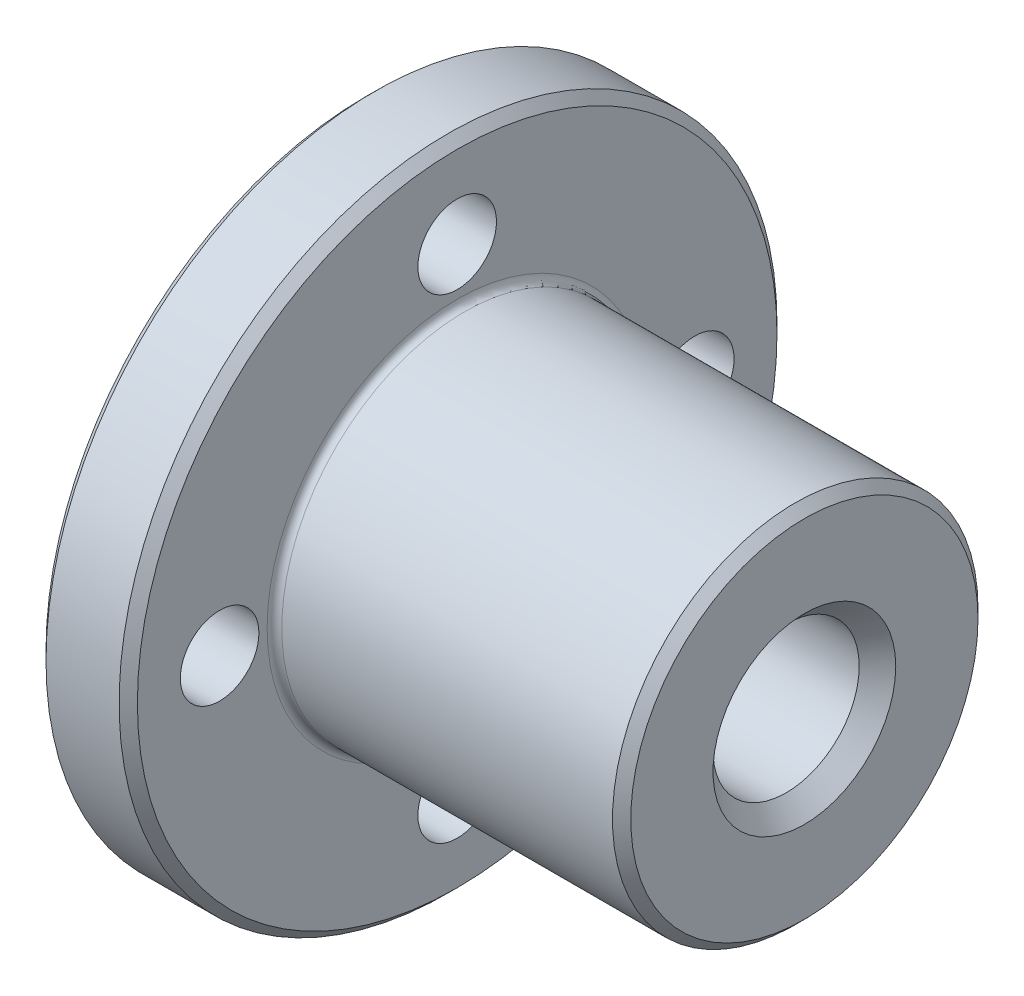
ISO-10303-21;
HEADER;
FILE_DESCRIPTION(('STEP AP214'),'2;1');
FILE_NAME('part.step','',(''),(''),'','','');
FILE_SCHEMA(('AUTOMOTIVE_DESIGN { 1 0 10303 214 1 1 1 1 }'));
ENDSEC;
DATA;
#1=APPLICATION_CONTEXT('core data for automotive mechanical design processes');
#2=APPLICATION_PROTOCOL_DEFINITION('international standard','automotive_design',2000,#1);
#3=PRODUCT_CONTEXT('',#1,'mechanical');
#4=PRODUCT('Part','Part','',(#3));
#5=PRODUCT_RELATED_PRODUCT_CATEGORY('part','',(#4));
#6=PRODUCT_DEFINITION_FORMATION('','',#4);
#7=PRODUCT_DEFINITION_CONTEXT('part definition',#1,'design');
#8=PRODUCT_DEFINITION('design','',#6,#7);
#9=PRODUCT_DEFINITION_SHAPE('','',#8);
#10=(LENGTH_UNIT() NAMED_UNIT(*) SI_UNIT(.MILLI.,.METRE.));
#11=(NAMED_UNIT(*) PLANE_ANGLE_UNIT() SI_UNIT($,.RADIAN.));
#12=(NAMED_UNIT(*) SI_UNIT($,.STERADIAN.) SOLID_ANGLE_UNIT());
#13=UNCERTAINTY_MEASURE_WITH_UNIT(LENGTH_MEASURE(1.E-05),#10,'distance_accuracy_value','');
#14=(GEOMETRIC_REPRESENTATION_CONTEXT(3) GLOBAL_UNCERTAINTY_ASSIGNED_CONTEXT((#13)) GLOBAL_UNIT_ASSIGNED_CONTEXT((#10,
#11,#12)) REPRESENTATION_CONTEXT('',''));
#15=CARTESIAN_POINT('',(0.,0.,0.));
#16=DIRECTION('',(0.,0.,1.));
#17=DIRECTION('',(1.,0.,0.));
#18=AXIS2_PLACEMENT_3D('',#15,#16,#17);
#19=CARTESIAN_POINT('',(5.,0.,0.));
#20=DIRECTION('',(1.,0.,0.));
#21=DIRECTION('',(0.,0.,-1.));
#22=AXIS2_PLACEMENT_3D('',#19,#20,#21);
#23=PLANE('',#22);
#24=CARTESIAN_POINT('',(5.,0.,0.));
#25=DIRECTION('',(1.,0.,0.));
#26=DIRECTION('',(0.,0.,-1.));
#27=AXIS2_PLACEMENT_3D('',#24,#25,#26);
#28=CIRCLE('',#27,10.4);
#29=CARTESIAN_POINT('',(5.,0.,-10.4));
#30=VERTEX_POINT('',#29);
#31=EDGE_CURVE('E10',#30,#30,#28,.F.);
#32=ORIENTED_EDGE('',*,*,#31,.T.);
#33=EDGE_LOOP('',(#32));
#34=FACE_BOUND('',#33,.T.);
#35=CARTESIAN_POINT('',(5.,0.,0.));
#36=DIRECTION('',(1.,0.,0.));
#37=DIRECTION('',(0.,0.,-1.));
#38=AXIS2_PLACEMENT_3D('',#35,#36,#37);
#39=CIRCLE('',#38,17.5);
#40=CARTESIAN_POINT('',(5.,0.,-17.5));
#41=VERTEX_POINT('',#40);
#42=EDGE_CURVE('E74',#41,#41,#39,.T.);
#43=ORIENTED_EDGE('',*,*,#42,.T.);
#44=EDGE_LOOP('',(#43));
#45=FACE_BOUND('',#44,.T.);
#46=CARTESIAN_POINT('',(5.,13.,0.));
#47=DIRECTION('',(1.,0.,0.));
#48=DIRECTION('',(0.,0.,-1.));
#49=AXIS2_PLACEMENT_3D('',#46,#47,#48);
#50=CIRCLE('',#49,2.14999999999999);
#51=CARTESIAN_POINT('',(5.,13.,-2.14999999999999));
#52=VERTEX_POINT('',#51);
#53=EDGE_CURVE('E95',#52,#52,#50,.T.);
#54=ORIENTED_EDGE('',*,*,#53,.F.);
#55=EDGE_LOOP('',(#54));
#56=FACE_BOUND('',#55,.T.);
#57=CARTESIAN_POINT('',(5.,-13.,0.));
#58=DIRECTION('',(1.,0.,0.));
#59=DIRECTION('',(0.,0.,-1.));
#60=AXIS2_PLACEMENT_3D('',#57,#58,#59);
#61=CIRCLE('',#60,2.14999999999999);
#62=CARTESIAN_POINT('',(5.,-13.,-2.14999999999999));
#63=VERTEX_POINT('',#62);
#64=EDGE_CURVE('E89',#63,#63,#61,.T.);
#65=ORIENTED_EDGE('',*,*,#64,.F.);
#66=EDGE_LOOP('',(#65));
#67=FACE_BOUND('',#66,.T.);
#68=CARTESIAN_POINT('',(5.,0.,-13.));
#69=DIRECTION('',(1.,0.,0.));
#70=DIRECTION('',(0.,0.,-1.));
#71=AXIS2_PLACEMENT_3D('',#68,#69,#70);
#72=CIRCLE('',#71,2.14999999999999);
#73=CARTESIAN_POINT('',(5.,0.,-15.15));
#74=VERTEX_POINT('',#73);
#75=EDGE_CURVE('E83',#74,#74,#72,.T.);
#76=ORIENTED_EDGE('',*,*,#75,.F.);
#77=EDGE_LOOP('',(#76));
#78=FACE_BOUND('',#77,.T.);
#79=CARTESIAN_POINT('',(5.,0.,13.));
#80=DIRECTION('',(1.,0.,0.));
#81=DIRECTION('',(0.,0.,-1.));
#82=AXIS2_PLACEMENT_3D('',#79,#80,#81);
#83=CIRCLE('',#82,2.14999999999999);
#84=CARTESIAN_POINT('',(5.,0.,10.85));
#85=VERTEX_POINT('',#84);
#86=EDGE_CURVE('E77',#85,#85,#83,.T.);
#87=ORIENTED_EDGE('',*,*,#86,.F.);
#88=EDGE_LOOP('',(#87));
#89=FACE_BOUND('',#88,.T.);
#90=ADVANCED_FACE('F33',(#34,#45,#56,#67,#78,#89),#23,.T.);
#91=CARTESIAN_POINT('',(0.,0.,0.));
#92=DIRECTION('',(1.,0.,0.));
#93=DIRECTION('',(0.,0.,-1.));
#94=AXIS2_PLACEMENT_3D('',#91,#92,#93);
#95=CYLINDRICAL_SURFACE('',#94,18.);
#96=CARTESIAN_POINT('',(4.5,0.,0.));
#97=DIRECTION('',(1.,0.,0.));
#98=DIRECTION('',(0.,0.,-1.));
#99=AXIS2_PLACEMENT_3D('',#96,#97,#98);
#100=CIRCLE('',#99,18.);
#101=CARTESIAN_POINT('',(4.5,0.,-18.));
#102=VERTEX_POINT('',#101);
#103=EDGE_CURVE('E68',#102,#102,#100,.F.);
#104=ORIENTED_EDGE('',*,*,#103,.T.);
#105=EDGE_LOOP('',(#104));
#106=FACE_BOUND('',#105,.T.);
#107=CARTESIAN_POINT('',(0.49999999999999,0.,0.));
#108=DIRECTION('',(-1.,0.,0.));
#109=DIRECTION('',(0.,0.,1.));
#110=AXIS2_PLACEMENT_3D('',#107,#108,#109);
#111=CIRCLE('',#110,18.);
#112=CARTESIAN_POINT('',(0.49999999999999,0.,18.));
#113=VERTEX_POINT('',#112);
#114=EDGE_CURVE('E71',#113,#113,#111,.F.);
#115=ORIENTED_EDGE('',*,*,#114,.T.);
#116=EDGE_LOOP('',(#115));
#117=FACE_BOUND('',#116,.T.);
#118=ADVANCED_FACE('F108',(#106,#117),#95,.T.);
#119=CARTESIAN_POINT('',(0.,18.,0.));
#120=DIRECTION('',(-1.,0.,0.));
#121=DIRECTION('',(0.,0.,1.));
#122=AXIS2_PLACEMENT_3D('',#119,#120,#121);
#123=PLANE('',#122);
#124=CARTESIAN_POINT('',(0.,0.,0.));
#125=DIRECTION('',(-1.,0.,0.));
#126=DIRECTION('',(0.,0.,1.));
#127=AXIS2_PLACEMENT_3D('',#124,#125,#126);
#128=CIRCLE('',#127,4.99999999999999);
#129=CARTESIAN_POINT('',(0.,0.,4.99999999999999));
#130=VERTEX_POINT('',#129);
#131=EDGE_CURVE('E56',#130,#130,#128,.F.);
#132=ORIENTED_EDGE('',*,*,#131,.T.);
#133=EDGE_LOOP('',(#132));
#134=FACE_BOUND('',#133,.T.);
#135=CARTESIAN_POINT('',(0.,0.,0.));
#136=DIRECTION('',(-1.,0.,0.));
#137=DIRECTION('',(0.,0.,1.));
#138=AXIS2_PLACEMENT_3D('',#135,#136,#137);
#139=CIRCLE('',#138,17.5);
#140=CARTESIAN_POINT('',(0.,0.,17.5));
#141=VERTEX_POINT('',#140);
#142=EDGE_CURVE('E65',#141,#141,#139,.T.);
#143=ORIENTED_EDGE('',*,*,#142,.T.);
#144=EDGE_LOOP('',(#143));
#145=FACE_BOUND('',#144,.T.);
#146=CARTESIAN_POINT('',(0.,13.,0.));
#147=DIRECTION('',(-1.,0.,0.));
#148=DIRECTION('',(0.,0.,1.));
#149=AXIS2_PLACEMENT_3D('',#146,#147,#148);
#150=CIRCLE('',#149,2.14999999999999);
#151=CARTESIAN_POINT('',(0.,13.,2.14999999999999));
#152=VERTEX_POINT('',#151);
#153=EDGE_CURVE('E98',#152,#152,#150,.T.);
#154=ORIENTED_EDGE('',*,*,#153,.F.);
#155=EDGE_LOOP('',(#154));
#156=FACE_BOUND('',#155,.T.);
#157=CARTESIAN_POINT('',(0.,-13.,0.));
#158=DIRECTION('',(-1.,0.,0.));
#159=DIRECTION('',(0.,0.,1.));
#160=AXIS2_PLACEMENT_3D('',#157,#158,#159);
#161=CIRCLE('',#160,2.14999999999999);
#162=CARTESIAN_POINT('',(0.,-13.,2.14999999999999));
#163=VERTEX_POINT('',#162);
#164=EDGE_CURVE('E92',#163,#163,#161,.T.);
#165=ORIENTED_EDGE('',*,*,#164,.F.);
#166=EDGE_LOOP('',(#165));
#167=FACE_BOUND('',#166,.T.);
#168=CARTESIAN_POINT('',(0.,0.,-13.));
#169=DIRECTION('',(-1.,0.,0.));
#170=DIRECTION('',(0.,0.,1.));
#171=AXIS2_PLACEMENT_3D('',#168,#169,#170);
#172=CIRCLE('',#171,2.14999999999999);
#173=CARTESIAN_POINT('',(0.,0.,-10.85));
#174=VERTEX_POINT('',#173);
#175=EDGE_CURVE('E86',#174,#174,#172,.T.);
#176=ORIENTED_EDGE('',*,*,#175,.F.);
#177=EDGE_LOOP('',(#176));
#178=FACE_BOUND('',#177,.T.);
#179=CARTESIAN_POINT('',(0.,0.,13.));
#180=DIRECTION('',(-1.,0.,0.));
#181=DIRECTION('',(0.,0.,1.));
#182=AXIS2_PLACEMENT_3D('',#179,#180,#181);
#183=CIRCLE('',#182,2.14999999999999);
#184=CARTESIAN_POINT('',(0.,0.,15.15));
#185=VERTEX_POINT('',#184);
#186=EDGE_CURVE('E80',#185,#185,#183,.T.);
#187=ORIENTED_EDGE('',*,*,#186,.F.);
#188=EDGE_LOOP('',(#187));
#189=FACE_BOUND('',#188,.T.);
#190=ADVANCED_FACE('F104',(#134,#145,#156,#167,#178,#189),#123,.T.);
#191=CARTESIAN_POINT('',(24.,0.,0.));
#192=DIRECTION('',(-1.,0.,0.));
#193=DIRECTION('',(0.,0.,1.));
#194=AXIS2_PLACEMENT_3D('',#191,#192,#193);
#195=CYLINDRICAL_SURFACE('',#194,10.);
#196=CARTESIAN_POINT('',(5.4,0.,0.));
#197=DIRECTION('',(1.,0.,0.));
#198=DIRECTION('',(0.,0.,-1.));
#199=AXIS2_PLACEMENT_3D('',#196,#197,#198);
#200=CIRCLE('',#199,10.);
#201=CARTESIAN_POINT('',(5.4,0.,-10.));
#202=VERTEX_POINT('',#201);
#203=EDGE_CURVE('E40',#202,#202,#200,.T.);
#204=ORIENTED_EDGE('',*,*,#203,.T.);
#205=EDGE_LOOP('',(#204));
#206=FACE_BOUND('',#205,.T.);
#207=CARTESIAN_POINT('',(23.5,0.,0.));
#208=DIRECTION('',(1.,0.,0.));
#209=DIRECTION('',(0.,0.,-1.));
#210=AXIS2_PLACEMENT_3D('',#207,#208,#209);
#211=CIRCLE('',#210,10.);
#212=CARTESIAN_POINT('',(23.5,0.,-10.));
#213=VERTEX_POINT('',#212);
#214=EDGE_CURVE('E59',#213,#213,#211,.F.);
#215=ORIENTED_EDGE('',*,*,#214,.T.);
#216=EDGE_LOOP('',(#215));
#217=FACE_BOUND('',#216,.T.);
#218=ADVANCED_FACE('F107',(#206,#217),#195,.T.);
#219=CARTESIAN_POINT('',(24.,0.,0.));
#220=DIRECTION('',(1.,0.,0.));
#221=DIRECTION('',(0.,0.,-1.));
#222=AXIS2_PLACEMENT_3D('',#219,#220,#221);
#223=PLANE('',#222);
#224=CARTESIAN_POINT('',(24.,0.,0.));
#225=DIRECTION('',(1.,0.,0.));
#226=DIRECTION('',(0.,0.,-1.));
#227=AXIS2_PLACEMENT_3D('',#224,#225,#226);
#228=CIRCLE('',#227,4.99999999999998);
#229=CARTESIAN_POINT('',(24.,0.,-4.99999999999998));
#230=VERTEX_POINT('',#229);
#231=EDGE_CURVE('E44',#230,#230,#228,.F.);
#232=ORIENTED_EDGE('',*,*,#231,.T.);
#233=EDGE_LOOP('',(#232));
#234=FACE_BOUND('',#233,.T.);
#235=CARTESIAN_POINT('',(24.,0.,0.));
#236=DIRECTION('',(1.,0.,0.));
#237=DIRECTION('',(0.,0.,-1.));
#238=AXIS2_PLACEMENT_3D('',#235,#236,#237);
#239=CIRCLE('',#238,9.50000000000001);
#240=CARTESIAN_POINT('',(24.,0.,-9.50000000000001));
#241=VERTEX_POINT('',#240);
#242=EDGE_CURVE('E62',#241,#241,#239,.T.);
#243=ORIENTED_EDGE('',*,*,#242,.T.);
#244=EDGE_LOOP('',(#243));
#245=FACE_BOUND('',#244,.T.);
#246=ADVANCED_FACE('F120',(#234,#245),#223,.T.);
#247=CARTESIAN_POINT('',(0.,0.,13.));
#248=DIRECTION('',(-1.,0.,0.));
#249=DIRECTION('',(0.,0.,1.));
#250=AXIS2_PLACEMENT_3D('',#247,#248,#249);
#251=CYLINDRICAL_SURFACE('',#250,2.14999999999999);
#252=ORIENTED_EDGE('',*,*,#86,.T.);
#253=EDGE_LOOP('',(#252));
#254=FACE_BOUND('',#253,.T.);
#255=ORIENTED_EDGE('',*,*,#186,.T.);
#256=EDGE_LOOP('',(#255));
#257=FACE_BOUND('',#256,.T.);
#258=ADVANCED_FACE('F117',(#254,#257),#251,.F.);
#259=CARTESIAN_POINT('',(0.,0.,-13.));
#260=DIRECTION('',(-1.,0.,0.));
#261=DIRECTION('',(0.,0.,1.));
#262=AXIS2_PLACEMENT_3D('',#259,#260,#261);
#263=CYLINDRICAL_SURFACE('',#262,2.14999999999999);
#264=ORIENTED_EDGE('',*,*,#75,.T.);
#265=EDGE_LOOP('',(#264));
#266=FACE_BOUND('',#265,.T.);
#267=ORIENTED_EDGE('',*,*,#175,.T.);
#268=EDGE_LOOP('',(#267));
#269=FACE_BOUND('',#268,.T.);
#270=ADVANCED_FACE('F119',(#266,#269),#263,.F.);
#271=CARTESIAN_POINT('',(0.,-13.,0.));
#272=DIRECTION('',(-1.,0.,0.));
#273=DIRECTION('',(0.,0.,1.));
#274=AXIS2_PLACEMENT_3D('',#271,#272,#273);
#275=CYLINDRICAL_SURFACE('',#274,2.14999999999999);
#276=ORIENTED_EDGE('',*,*,#64,.T.);
#277=EDGE_LOOP('',(#276));
#278=FACE_BOUND('',#277,.T.);
#279=ORIENTED_EDGE('',*,*,#164,.T.);
#280=EDGE_LOOP('',(#279));
#281=FACE_BOUND('',#280,.T.);
#282=ADVANCED_FACE('F127',(#278,#281),#275,.F.);
#283=CARTESIAN_POINT('',(0.,13.,0.));
#284=DIRECTION('',(-1.,0.,0.));
#285=DIRECTION('',(0.,0.,1.));
#286=AXIS2_PLACEMENT_3D('',#283,#284,#285);
#287=CYLINDRICAL_SURFACE('',#286,2.14999999999999);
#288=ORIENTED_EDGE('',*,*,#53,.T.);
#289=EDGE_LOOP('',(#288));
#290=FACE_BOUND('',#289,.T.);
#291=ORIENTED_EDGE('',*,*,#153,.T.);
#292=EDGE_LOOP('',(#291));
#293=FACE_BOUND('',#292,.T.);
#294=ADVANCED_FACE('F102',(#290,#293),#287,.F.);
#295=CARTESIAN_POINT('',(24.,0.,0.));
#296=DIRECTION('',(1.,0.,0.));
#297=DIRECTION('',(0.,0.,-1.));
#298=AXIS2_PLACEMENT_3D('',#295,#296,#297);
#299=CYLINDRICAL_SURFACE('',#298,3.99999999999999);
#300=CARTESIAN_POINT('',(1.00000000000001,0.,0.));
#301=DIRECTION('',(-1.,0.,0.));
#302=DIRECTION('',(0.,0.,1.));
#303=AXIS2_PLACEMENT_3D('',#300,#301,#302);
#304=CIRCLE('',#303,3.99999999999999);
#305=CARTESIAN_POINT('',(1.00000000000001,0.,3.99999999999999));
#306=VERTEX_POINT('',#305);
#307=EDGE_CURVE('E48',#306,#306,#304,.T.);
#308=ORIENTED_EDGE('',*,*,#307,.T.);
#309=EDGE_LOOP('',(#308));
#310=FACE_BOUND('',#309,.T.);
#311=CARTESIAN_POINT('',(23.,0.,0.));
#312=DIRECTION('',(1.,0.,0.));
#313=DIRECTION('',(0.,0.,-1.));
#314=AXIS2_PLACEMENT_3D('',#311,#312,#313);
#315=CIRCLE('',#314,3.99999999999999);
#316=CARTESIAN_POINT('',(23.,0.,-3.99999999999999));
#317=VERTEX_POINT('',#316);
#318=EDGE_CURVE('E53',#317,#317,#315,.T.);
#319=ORIENTED_EDGE('',*,*,#318,.T.);
#320=EDGE_LOOP('',(#319));
#321=FACE_BOUND('',#320,.T.);
#322=ADVANCED_FACE('F146',(#310,#321),#299,.F.);
#323=CARTESIAN_POINT('',(5.,0.,0.));
#324=DIRECTION('',(-1.,0.,0.));
#325=DIRECTION('',(0.,0.,1.));
#326=AXIS2_PLACEMENT_3D('',#323,#324,#325);
#327=CONICAL_SURFACE('',#326,17.5,0.785398163397445);
#328=ORIENTED_EDGE('',*,*,#103,.F.);
#329=EDGE_LOOP('',(#328));
#330=FACE_BOUND('',#329,.T.);
#331=ORIENTED_EDGE('',*,*,#42,.F.);
#332=EDGE_LOOP('',(#331));
#333=FACE_BOUND('',#332,.T.);
#334=ADVANCED_FACE('F142',(#330,#333),#327,.T.);
#335=CARTESIAN_POINT('',(0.49999999999999,0.,0.));
#336=DIRECTION('',(1.,0.,0.));
#337=DIRECTION('',(0.,0.,-1.));
#338=AXIS2_PLACEMENT_3D('',#335,#336,#337);
#339=CONICAL_SURFACE('',#338,18.,0.785398163397448);
#340=ORIENTED_EDGE('',*,*,#142,.F.);
#341=EDGE_LOOP('',(#340));
#342=FACE_BOUND('',#341,.T.);
#343=ORIENTED_EDGE('',*,*,#114,.F.);
#344=EDGE_LOOP('',(#343));
#345=FACE_BOUND('',#344,.T.);
#346=ADVANCED_FACE('F145',(#342,#345),#339,.T.);
#347=CARTESIAN_POINT('',(24.,0.,0.));
#348=DIRECTION('',(-1.,0.,0.));
#349=DIRECTION('',(0.,0.,1.));
#350=AXIS2_PLACEMENT_3D('',#347,#348,#349);
#351=CONICAL_SURFACE('',#350,9.50000000000001,0.785398163397441);
#352=ORIENTED_EDGE('',*,*,#214,.F.);
#353=EDGE_LOOP('',(#352));
#354=FACE_BOUND('',#353,.T.);
#355=ORIENTED_EDGE('',*,*,#242,.F.);
#356=EDGE_LOOP('',(#355));
#357=FACE_BOUND('',#356,.T.);
#358=ADVANCED_FACE('F150',(#354,#357),#351,.T.);
#359=CARTESIAN_POINT('',(0.,0.,0.));
#360=DIRECTION('',(-1.,0.,0.));
#361=DIRECTION('',(0.,0.,1.));
#362=AXIS2_PLACEMENT_3D('',#359,#360,#361);
#363=CONICAL_SURFACE('',#362,4.99999999999999,0.785398163397443);
#364=ORIENTED_EDGE('',*,*,#307,.F.);
#365=EDGE_LOOP('',(#364));
#366=FACE_BOUND('',#365,.T.);
#367=ORIENTED_EDGE('',*,*,#131,.F.);
#368=EDGE_LOOP('',(#367));
#369=FACE_BOUND('',#368,.T.);
#370=ADVANCED_FACE('F154',(#366,#369),#363,.F.);
#371=CARTESIAN_POINT('',(23.,0.,0.));
#372=DIRECTION('',(1.,0.,0.));
#373=DIRECTION('',(0.,0.,-1.));
#374=AXIS2_PLACEMENT_3D('',#371,#372,#373);
#375=CONICAL_SURFACE('',#374,3.99999999999999,0.78539816339745);
#376=ORIENTED_EDGE('',*,*,#231,.F.);
#377=EDGE_LOOP('',(#376));
#378=FACE_BOUND('',#377,.T.);
#379=ORIENTED_EDGE('',*,*,#318,.F.);
#380=EDGE_LOOP('',(#379));
#381=FACE_BOUND('',#380,.T.);
#382=ADVANCED_FACE('F157',(#378,#381),#375,.F.);
#383=CARTESIAN_POINT('',(5.4,0.,0.));
#384=DIRECTION('',(1.,0.,0.));
#385=DIRECTION('',(0.,0.,-1.));
#386=AXIS2_PLACEMENT_3D('',#383,#384,#385);
#387=TOROIDAL_SURFACE('',#386,10.4,0.400000000000002);
#388=ORIENTED_EDGE('',*,*,#31,.F.);
#389=EDGE_LOOP('',(#388));
#390=FACE_BOUND('',#389,.T.);
#391=ORIENTED_EDGE('',*,*,#203,.F.);
#392=EDGE_LOOP('',(#391));
#393=FACE_BOUND('',#392,.T.);
#394=ADVANCED_FACE('F35',(#390,#393),#387,.F.);
#395=CLOSED_SHELL('',(#90,#118,#190,#218,#246,#258,#270,#282,#294,#322,#334,#346,#358,#370,#382,#394));
#396=MANIFOLD_SOLID_BREP('B2',#395);
#397=ADVANCED_BREP_SHAPE_REPRESENTATION('',(#18,#396),#14);
#398=SHAPE_DEFINITION_REPRESENTATION(#9,#397);
ENDSEC;
END-ISO-10303-21;
